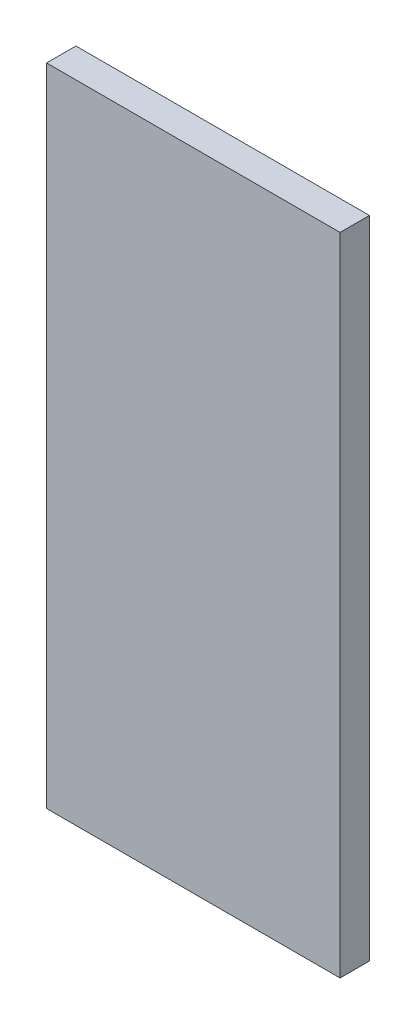
ISO-10303-21;
HEADER;
FILE_DESCRIPTION(('STEP AP214'),'2;1');
FILE_NAME('part.step','',(''),(''),'','','');
FILE_SCHEMA(('AUTOMOTIVE_DESIGN { 1 0 10303 214 1 1 1 1 }'));
ENDSEC;
DATA;
#1=APPLICATION_CONTEXT('core data for automotive mechanical design processes');
#2=APPLICATION_PROTOCOL_DEFINITION('international standard','automotive_design',2000,#1);
#3=PRODUCT_CONTEXT('',#1,'mechanical');
#4=PRODUCT('Part','Part','',(#3));
#5=PRODUCT_RELATED_PRODUCT_CATEGORY('part','',(#4));
#6=PRODUCT_DEFINITION_FORMATION('','',#4);
#7=PRODUCT_DEFINITION_CONTEXT('part definition',#1,'design');
#8=PRODUCT_DEFINITION('design','',#6,#7);
#9=PRODUCT_DEFINITION_SHAPE('','',#8);
#10=(LENGTH_UNIT() NAMED_UNIT(*) SI_UNIT(.MILLI.,.METRE.));
#11=(NAMED_UNIT(*) PLANE_ANGLE_UNIT() SI_UNIT($,.RADIAN.));
#12=(NAMED_UNIT(*) SI_UNIT($,.STERADIAN.) SOLID_ANGLE_UNIT());
#13=UNCERTAINTY_MEASURE_WITH_UNIT(LENGTH_MEASURE(1.E-05),#10,'distance_accuracy_value','');
#14=(GEOMETRIC_REPRESENTATION_CONTEXT(3) GLOBAL_UNCERTAINTY_ASSIGNED_CONTEXT((#13)) GLOBAL_UNIT_ASSIGNED_CONTEXT((#10,
#11,#12)) REPRESENTATION_CONTEXT('',''));
#15=CARTESIAN_POINT('',(0.,0.,0.));
#16=DIRECTION('',(0.,0.,1.));
#17=DIRECTION('',(1.,0.,0.));
#18=AXIS2_PLACEMENT_3D('',#15,#16,#17);
#19=CARTESIAN_POINT('',(0.,0.,12.7));
#20=DIRECTION('',(1.,0.,0.));
#21=DIRECTION('',(0.,0.,-1.));
#22=AXIS2_PLACEMENT_3D('',#19,#20,#21);
#23=PLANE('',#22);
#24=DIRECTION('',(0.,-1.,0.));
#25=VECTOR('',#24,1.);
#26=CARTESIAN_POINT('',(0.,0.,0.));
#27=LINE('',#26,#25);
#28=CARTESIAN_POINT('',(0.,279.4,0.));
#29=VERTEX_POINT('',#28);
#30=CARTESIAN_POINT('',(0.,0.,0.));
#31=VERTEX_POINT('',#30);
#32=EDGE_CURVE('E95',#29,#31,#27,.T.);
#33=ORIENTED_EDGE('',*,*,#32,.T.);
#34=DIRECTION('',(0.,0.,-1.));
#35=VECTOR('',#34,1.);
#36=CARTESIAN_POINT('',(0.,0.,12.7));
#37=LINE('',#36,#35);
#38=CARTESIAN_POINT('',(0.,0.,12.7));
#39=VERTEX_POINT('',#38);
#40=EDGE_CURVE('E11',#39,#31,#37,.T.);
#41=ORIENTED_EDGE('',*,*,#40,.F.);
#42=DIRECTION('',(0.,-1.,0.));
#43=VECTOR('',#42,1.);
#44=CARTESIAN_POINT('',(0.,0.,12.7));
#45=LINE('',#44,#43);
#46=CARTESIAN_POINT('',(0.,279.4,12.7));
#47=VERTEX_POINT('',#46);
#48=EDGE_CURVE('E83',#47,#39,#45,.T.);
#49=ORIENTED_EDGE('',*,*,#48,.F.);
#50=DIRECTION('',(0.,0.,-1.));
#51=VECTOR('',#50,1.);
#52=CARTESIAN_POINT('',(0.,279.4,12.7));
#53=LINE('',#52,#51);
#54=EDGE_CURVE('E91',#47,#29,#53,.T.);
#55=ORIENTED_EDGE('',*,*,#54,.T.);
#56=EDGE_LOOP('',(#33,#41,#49,#55));
#57=FACE_BOUND('',#56,.T.);
#58=ADVANCED_FACE('F32',(#57),#23,.F.);
#59=CARTESIAN_POINT('',(0.,0.,12.7));
#60=DIRECTION('',(0.,1.,0.));
#61=DIRECTION('',(0.,0.,1.));
#62=AXIS2_PLACEMENT_3D('',#59,#60,#61);
#63=PLANE('',#62);
#64=DIRECTION('',(1.,0.,0.));
#65=VECTOR('',#64,1.);
#66=CARTESIAN_POINT('',(0.,0.,0.));
#67=LINE('',#66,#65);
#68=CARTESIAN_POINT('',(127.,0.,0.));
#69=VERTEX_POINT('',#68);
#70=EDGE_CURVE('E87',#31,#69,#67,.T.);
#71=ORIENTED_EDGE('',*,*,#70,.T.);
#72=DIRECTION('',(0.,0.,-1.));
#73=VECTOR('',#72,1.);
#74=CARTESIAN_POINT('',(127.,0.,12.7));
#75=LINE('',#74,#73);
#76=CARTESIAN_POINT('',(127.,0.,12.7));
#77=VERTEX_POINT('',#76);
#78=EDGE_CURVE('E40',#77,#69,#75,.T.);
#79=ORIENTED_EDGE('',*,*,#78,.F.);
#80=DIRECTION('',(1.,0.,0.));
#81=VECTOR('',#80,1.);
#82=CARTESIAN_POINT('',(0.,0.,12.7));
#83=LINE('',#82,#81);
#84=EDGE_CURVE('E78',#39,#77,#83,.T.);
#85=ORIENTED_EDGE('',*,*,#84,.F.);
#86=ORIENTED_EDGE('',*,*,#40,.T.);
#87=EDGE_LOOP('',(#71,#79,#85,#86));
#88=FACE_BOUND('',#87,.T.);
#89=ADVANCED_FACE('F86',(#88),#63,.F.);
#90=CARTESIAN_POINT('',(127.,0.,12.7));
#91=DIRECTION('',(-1.,0.,0.));
#92=DIRECTION('',(0.,0.,1.));
#93=AXIS2_PLACEMENT_3D('',#90,#91,#92);
#94=PLANE('',#93);
#95=DIRECTION('',(0.,1.,0.));
#96=VECTOR('',#95,1.);
#97=CARTESIAN_POINT('',(127.,0.,0.));
#98=LINE('',#97,#96);
#99=CARTESIAN_POINT('',(127.,279.4,0.));
#100=VERTEX_POINT('',#99);
#101=EDGE_CURVE('E65',#69,#100,#98,.T.);
#102=ORIENTED_EDGE('',*,*,#101,.T.);
#103=DIRECTION('',(0.,0.,-1.));
#104=VECTOR('',#103,1.);
#105=CARTESIAN_POINT('',(127.,279.4,12.7));
#106=LINE('',#105,#104);
#107=CARTESIAN_POINT('',(127.,279.4,12.7));
#108=VERTEX_POINT('',#107);
#109=EDGE_CURVE('E88',#108,#100,#106,.T.);
#110=ORIENTED_EDGE('',*,*,#109,.F.);
#111=DIRECTION('',(0.,1.,0.));
#112=VECTOR('',#111,1.);
#113=CARTESIAN_POINT('',(127.,0.,12.7));
#114=LINE('',#113,#112);
#115=EDGE_CURVE('E81',#77,#108,#114,.T.);
#116=ORIENTED_EDGE('',*,*,#115,.F.);
#117=ORIENTED_EDGE('',*,*,#78,.T.);
#118=EDGE_LOOP('',(#102,#110,#116,#117));
#119=FACE_BOUND('',#118,.T.);
#120=ADVANCED_FACE('F89',(#119),#94,.F.);
#121=CARTESIAN_POINT('',(0.,279.4,12.7));
#122=DIRECTION('',(0.,-1.,0.));
#123=DIRECTION('',(0.,0.,-1.));
#124=AXIS2_PLACEMENT_3D('',#121,#122,#123);
#125=PLANE('',#124);
#126=DIRECTION('',(-1.,0.,0.));
#127=VECTOR('',#126,1.);
#128=CARTESIAN_POINT('',(0.,279.4,0.));
#129=LINE('',#128,#127);
#130=EDGE_CURVE('E71',#100,#29,#129,.T.);
#131=ORIENTED_EDGE('',*,*,#130,.T.);
#132=ORIENTED_EDGE('',*,*,#54,.F.);
#133=DIRECTION('',(-1.,0.,0.));
#134=VECTOR('',#133,1.);
#135=CARTESIAN_POINT('',(0.,279.4,12.7));
#136=LINE('',#135,#134);
#137=EDGE_CURVE('E48',#108,#47,#136,.T.);
#138=ORIENTED_EDGE('',*,*,#137,.F.);
#139=ORIENTED_EDGE('',*,*,#109,.T.);
#140=EDGE_LOOP('',(#131,#132,#138,#139));
#141=FACE_BOUND('',#140,.T.);
#142=ADVANCED_FACE('F102',(#141),#125,.F.);
#143=CARTESIAN_POINT('',(0.,0.,12.7));
#144=DIRECTION('',(0.,0.,-1.));
#145=DIRECTION('',(-1.,0.,0.));
#146=AXIS2_PLACEMENT_3D('',#143,#144,#145);
#147=PLANE('',#146);
#148=ORIENTED_EDGE('',*,*,#48,.T.);
#149=ORIENTED_EDGE('',*,*,#84,.T.);
#150=ORIENTED_EDGE('',*,*,#115,.T.);
#151=ORIENTED_EDGE('',*,*,#137,.T.);
#152=EDGE_LOOP('',(#148,#149,#150,#151));
#153=FACE_BOUND('',#152,.T.);
#154=ADVANCED_FACE('F79',(#153),#147,.F.);
#155=CARTESIAN_POINT('',(0.,0.,0.));
#156=DIRECTION('',(0.,0.,-1.));
#157=DIRECTION('',(-1.,0.,0.));
#158=AXIS2_PLACEMENT_3D('',#155,#156,#157);
#159=PLANE('',#158);
#160=ORIENTED_EDGE('',*,*,#32,.F.);
#161=ORIENTED_EDGE('',*,*,#130,.F.);
#162=ORIENTED_EDGE('',*,*,#101,.F.);
#163=ORIENTED_EDGE('',*,*,#70,.F.);
#164=EDGE_LOOP('',(#160,#161,#162,#163));
#165=FACE_BOUND('',#164,.T.);
#166=ADVANCED_FACE('F105',(#165),#159,.T.);
#167=CLOSED_SHELL('',(#58,#89,#120,#142,#154,#166));
#168=MANIFOLD_SOLID_BREP('B2',#167);
#169=ADVANCED_BREP_SHAPE_REPRESENTATION('',(#18,#168),#14);
#170=SHAPE_DEFINITION_REPRESENTATION(#9,#169);
ENDSEC;
END-ISO-10303-21;
